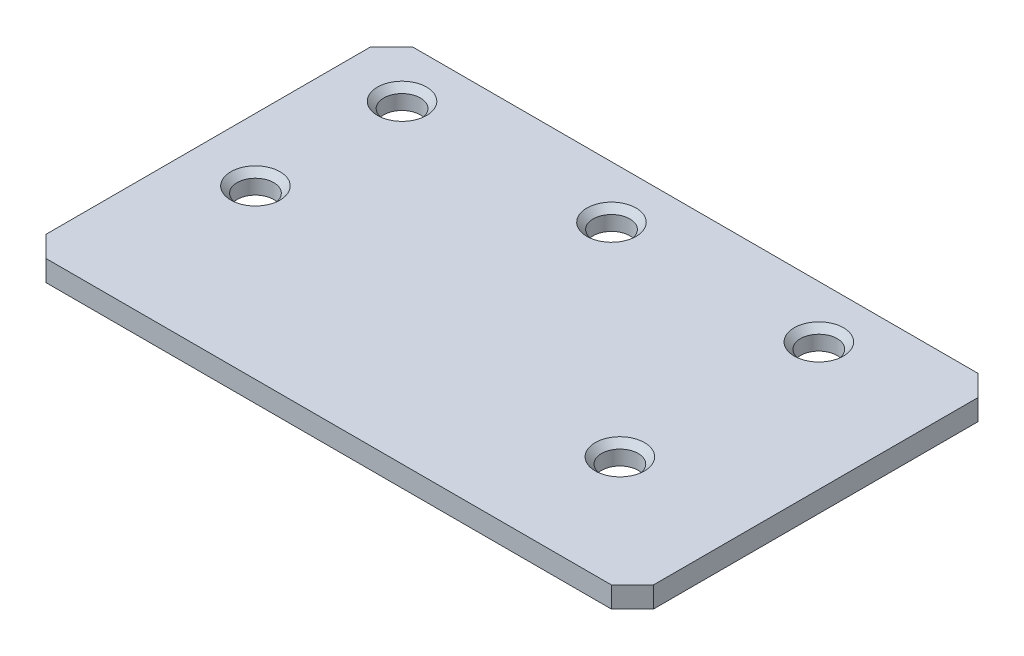
ISO-10303-21;
HEADER;
FILE_DESCRIPTION(('STEP AP214'),'2;1');
FILE_NAME('part.step','',(''),(''),'','','');
FILE_SCHEMA(('AUTOMOTIVE_DESIGN { 1 0 10303 214 1 1 1 1 }'));
ENDSEC;
DATA;
#1=APPLICATION_CONTEXT('core data for automotive mechanical design processes');
#2=APPLICATION_PROTOCOL_DEFINITION('international standard','automotive_design',2000,#1);
#3=PRODUCT_CONTEXT('',#1,'mechanical');
#4=PRODUCT('Part','Part','',(#3));
#5=PRODUCT_RELATED_PRODUCT_CATEGORY('part','',(#4));
#6=PRODUCT_DEFINITION_FORMATION('','',#4);
#7=PRODUCT_DEFINITION_CONTEXT('part definition',#1,'design');
#8=PRODUCT_DEFINITION('design','',#6,#7);
#9=PRODUCT_DEFINITION_SHAPE('','',#8);
#10=(LENGTH_UNIT() NAMED_UNIT(*) SI_UNIT(.MILLI.,.METRE.));
#11=(NAMED_UNIT(*) PLANE_ANGLE_UNIT() SI_UNIT($,.RADIAN.));
#12=(NAMED_UNIT(*) SI_UNIT($,.STERADIAN.) SOLID_ANGLE_UNIT());
#13=UNCERTAINTY_MEASURE_WITH_UNIT(LENGTH_MEASURE(1.E-05),#10,'distance_accuracy_value','');
#14=(GEOMETRIC_REPRESENTATION_CONTEXT(3) GLOBAL_UNCERTAINTY_ASSIGNED_CONTEXT((#13)) GLOBAL_UNIT_ASSIGNED_CONTEXT((#10,
#11,#12)) REPRESENTATION_CONTEXT('',''));
#15=CARTESIAN_POINT('',(0.,0.,0.));
#16=DIRECTION('',(0.,0.,1.));
#17=DIRECTION('',(1.,0.,0.));
#18=AXIS2_PLACEMENT_3D('',#15,#16,#17);
#19=CARTESIAN_POINT('',(29.,2.,17.5));
#20=DIRECTION('',(-1.,0.,0.));
#21=DIRECTION('',(0.,0.,1.));
#22=AXIS2_PLACEMENT_3D('',#19,#20,#21);
#23=PLANE('',#22);
#24=DIRECTION('',(0.,0.,-1.));
#25=VECTOR('',#24,1.);
#26=CARTESIAN_POINT('',(29.,2.,17.5));
#27=LINE('',#26,#25);
#28=CARTESIAN_POINT('',(29.,2.,15.5));
#29=VERTEX_POINT('',#28);
#30=CARTESIAN_POINT('',(29.,2.,-15.5));
#31=VERTEX_POINT('',#30);
#32=EDGE_CURVE('E149',#29,#31,#27,.T.);
#33=ORIENTED_EDGE('',*,*,#32,.F.);
#34=DIRECTION('',(0.,-1.,0.));
#35=VECTOR('',#34,1.);
#36=CARTESIAN_POINT('',(29.,2.,15.5));
#37=LINE('',#36,#35);
#38=CARTESIAN_POINT('',(29.,0.,15.5));
#39=VERTEX_POINT('',#38);
#40=EDGE_CURVE('E11',#29,#39,#37,.T.);
#41=ORIENTED_EDGE('',*,*,#40,.T.);
#42=DIRECTION('',(0.,0.,-1.));
#43=VECTOR('',#42,1.);
#44=CARTESIAN_POINT('',(29.,0.,17.5));
#45=LINE('',#44,#43);
#46=CARTESIAN_POINT('',(29.,0.,-15.5));
#47=VERTEX_POINT('',#46);
#48=EDGE_CURVE('E151',#39,#47,#45,.T.);
#49=ORIENTED_EDGE('',*,*,#48,.T.);
#50=DIRECTION('',(0.,1.,0.));
#51=VECTOR('',#50,1.);
#52=CARTESIAN_POINT('',(29.,2.,-15.5));
#53=LINE('',#52,#51);
#54=EDGE_CURVE('E57',#47,#31,#53,.T.);
#55=ORIENTED_EDGE('',*,*,#54,.T.);
#56=EDGE_LOOP('',(#33,#41,#49,#55));
#57=FACE_BOUND('',#56,.T.);
#58=ADVANCED_FACE('F47',(#57),#23,.F.);
#59=CARTESIAN_POINT('',(-29.,2.,-17.5));
#60=DIRECTION('',(0.,0.,1.));
#61=DIRECTION('',(1.,0.,0.));
#62=AXIS2_PLACEMENT_3D('',#59,#60,#61);
#63=PLANE('',#62);
#64=DIRECTION('',(-1.,0.,0.));
#65=VECTOR('',#64,1.);
#66=CARTESIAN_POINT('',(-29.,0.,-17.5));
#67=LINE('',#66,#65);
#68=CARTESIAN_POINT('',(27.,0.,-17.5));
#69=VERTEX_POINT('',#68);
#70=CARTESIAN_POINT('',(-27.,0.,-17.5));
#71=VERTEX_POINT('',#70);
#72=EDGE_CURVE('E145',#69,#71,#67,.T.);
#73=ORIENTED_EDGE('',*,*,#72,.T.);
#74=DIRECTION('',(0.,1.,0.));
#75=VECTOR('',#74,1.);
#76=CARTESIAN_POINT('',(-27.,2.,-17.5));
#77=LINE('',#76,#75);
#78=CARTESIAN_POINT('',(-27.,2.,-17.5));
#79=VERTEX_POINT('',#78);
#80=EDGE_CURVE('E121',#71,#79,#77,.T.);
#81=ORIENTED_EDGE('',*,*,#80,.T.);
#82=DIRECTION('',(-1.,0.,0.));
#83=VECTOR('',#82,1.);
#84=CARTESIAN_POINT('',(-29.,2.,-17.5));
#85=LINE('',#84,#83);
#86=CARTESIAN_POINT('',(27.,2.,-17.5));
#87=VERTEX_POINT('',#86);
#88=EDGE_CURVE('E201',#87,#79,#85,.T.);
#89=ORIENTED_EDGE('',*,*,#88,.F.);
#90=DIRECTION('',(0.,-1.,0.));
#91=VECTOR('',#90,1.);
#92=CARTESIAN_POINT('',(27.,2.,-17.5));
#93=LINE('',#92,#91);
#94=EDGE_CURVE('E127',#87,#69,#93,.T.);
#95=ORIENTED_EDGE('',*,*,#94,.T.);
#96=EDGE_LOOP('',(#73,#81,#89,#95));
#97=FACE_BOUND('',#96,.T.);
#98=ADVANCED_FACE('F205',(#97),#63,.F.);
#99=CARTESIAN_POINT('',(-29.,2.,17.5));
#100=DIRECTION('',(1.,0.,0.));
#101=DIRECTION('',(0.,0.,-1.));
#102=AXIS2_PLACEMENT_3D('',#99,#100,#101);
#103=PLANE('',#102);
#104=DIRECTION('',(0.,0.,1.));
#105=VECTOR('',#104,1.);
#106=CARTESIAN_POINT('',(-29.,2.,17.5));
#107=LINE('',#106,#105);
#108=CARTESIAN_POINT('',(-29.,2.,-15.5));
#109=VERTEX_POINT('',#108);
#110=CARTESIAN_POINT('',(-29.,2.,15.5));
#111=VERTEX_POINT('',#110);
#112=EDGE_CURVE('E136',#109,#111,#107,.T.);
#113=ORIENTED_EDGE('',*,*,#112,.F.);
#114=DIRECTION('',(0.,-1.,0.));
#115=VECTOR('',#114,1.);
#116=CARTESIAN_POINT('',(-29.,2.,-15.5));
#117=LINE('',#116,#115);
#118=CARTESIAN_POINT('',(-29.,0.,-15.5));
#119=VERTEX_POINT('',#118);
#120=EDGE_CURVE('E120',#109,#119,#117,.T.);
#121=ORIENTED_EDGE('',*,*,#120,.T.);
#122=DIRECTION('',(0.,0.,1.));
#123=VECTOR('',#122,1.);
#124=CARTESIAN_POINT('',(-29.,0.,17.5));
#125=LINE('',#124,#123);
#126=CARTESIAN_POINT('',(-29.,0.,15.5));
#127=VERTEX_POINT('',#126);
#128=EDGE_CURVE('E134',#119,#127,#125,.T.);
#129=ORIENTED_EDGE('',*,*,#128,.T.);
#130=DIRECTION('',(0.,1.,0.));
#131=VECTOR('',#130,1.);
#132=CARTESIAN_POINT('',(-29.,2.,15.5));
#133=LINE('',#132,#131);
#134=EDGE_CURVE('E139',#127,#111,#133,.T.);
#135=ORIENTED_EDGE('',*,*,#134,.T.);
#136=EDGE_LOOP('',(#113,#121,#129,#135));
#137=FACE_BOUND('',#136,.T.);
#138=ADVANCED_FACE('F133',(#137),#103,.F.);
#139=CARTESIAN_POINT('',(-29.,2.,17.5));
#140=DIRECTION('',(0.,0.,-1.));
#141=DIRECTION('',(-1.,0.,0.));
#142=AXIS2_PLACEMENT_3D('',#139,#140,#141);
#143=PLANE('',#142);
#144=DIRECTION('',(1.,0.,0.));
#145=VECTOR('',#144,1.);
#146=CARTESIAN_POINT('',(-29.,2.,17.5));
#147=LINE('',#146,#145);
#148=CARTESIAN_POINT('',(-27.,2.,17.5));
#149=VERTEX_POINT('',#148);
#150=CARTESIAN_POINT('',(27.,2.,17.5));
#151=VERTEX_POINT('',#150);
#152=EDGE_CURVE('E156',#149,#151,#147,.T.);
#153=ORIENTED_EDGE('',*,*,#152,.F.);
#154=DIRECTION('',(0.,-1.,0.));
#155=VECTOR('',#154,1.);
#156=CARTESIAN_POINT('',(-27.,2.,17.5));
#157=LINE('',#156,#155);
#158=CARTESIAN_POINT('',(-27.,0.,17.5));
#159=VERTEX_POINT('',#158);
#160=EDGE_CURVE('E183',#149,#159,#157,.T.);
#161=ORIENTED_EDGE('',*,*,#160,.T.);
#162=DIRECTION('',(1.,0.,0.));
#163=VECTOR('',#162,1.);
#164=CARTESIAN_POINT('',(-29.,0.,17.5));
#165=LINE('',#164,#163);
#166=CARTESIAN_POINT('',(27.,0.,17.5));
#167=VERTEX_POINT('',#166);
#168=EDGE_CURVE('E144',#159,#167,#165,.T.);
#169=ORIENTED_EDGE('',*,*,#168,.T.);
#170=DIRECTION('',(0.,1.,0.));
#171=VECTOR('',#170,1.);
#172=CARTESIAN_POINT('',(27.,2.,17.5));
#173=LINE('',#172,#171);
#174=EDGE_CURVE('E64',#167,#151,#173,.T.);
#175=ORIENTED_EDGE('',*,*,#174,.T.);
#176=EDGE_LOOP('',(#153,#161,#169,#175));
#177=FACE_BOUND('',#176,.T.);
#178=ADVANCED_FACE('F279',(#177),#143,.F.);
#179=CARTESIAN_POINT('',(0.,2.,0.));
#180=DIRECTION('',(0.,-1.,0.));
#181=DIRECTION('',(0.,0.,-1.));
#182=AXIS2_PLACEMENT_3D('',#179,#180,#181);
#183=PLANE('',#182);
#184=CARTESIAN_POINT('',(-23.,2.,-12.5));
#185=DIRECTION('',(0.,1.,0.));
#186=DIRECTION('',(0.,0.,1.));
#187=AXIS2_PLACEMENT_3D('',#184,#185,#186);
#188=CIRCLE('',#187,2.35);
#189=CARTESIAN_POINT('',(-23.,2.,-10.15));
#190=VERTEX_POINT('',#189);
#191=EDGE_CURVE('E270',#190,#190,#188,.T.);
#192=ORIENTED_EDGE('',*,*,#191,.F.);
#193=EDGE_LOOP('',(#192));
#194=FACE_BOUND('',#193,.T.);
#195=CARTESIAN_POINT('',(-3.,2.,-12.5));
#196=DIRECTION('',(0.,1.,0.));
#197=DIRECTION('',(0.,0.,1.));
#198=AXIS2_PLACEMENT_3D('',#195,#196,#197);
#199=CIRCLE('',#198,2.35);
#200=CARTESIAN_POINT('',(-3.,2.,-10.15));
#201=VERTEX_POINT('',#200);
#202=EDGE_CURVE('E258',#201,#201,#199,.T.);
#203=ORIENTED_EDGE('',*,*,#202,.F.);
#204=EDGE_LOOP('',(#203));
#205=FACE_BOUND('',#204,.T.);
#206=CARTESIAN_POINT('',(16.8,2.,-12.5));
#207=DIRECTION('',(0.,1.,0.));
#208=DIRECTION('',(0.,0.,1.));
#209=AXIS2_PLACEMENT_3D('',#206,#207,#208);
#210=CIRCLE('',#209,2.35);
#211=CARTESIAN_POINT('',(16.8,2.,-10.15));
#212=VERTEX_POINT('',#211);
#213=EDGE_CURVE('E246',#212,#212,#210,.T.);
#214=ORIENTED_EDGE('',*,*,#213,.F.);
#215=EDGE_LOOP('',(#214));
#216=FACE_BOUND('',#215,.T.);
#217=CARTESIAN_POINT('',(16.8,2.,6.5));
#218=DIRECTION('',(0.,1.,0.));
#219=DIRECTION('',(0.,0.,1.));
#220=AXIS2_PLACEMENT_3D('',#217,#218,#219);
#221=CIRCLE('',#220,2.35);
#222=CARTESIAN_POINT('',(16.8,2.,8.85));
#223=VERTEX_POINT('',#222);
#224=EDGE_CURVE('E234',#223,#223,#221,.T.);
#225=ORIENTED_EDGE('',*,*,#224,.F.);
#226=EDGE_LOOP('',(#225));
#227=FACE_BOUND('',#226,.T.);
#228=CARTESIAN_POINT('',(-23.,2.,1.5));
#229=DIRECTION('',(0.,1.,0.));
#230=DIRECTION('',(0.,0.,1.));
#231=AXIS2_PLACEMENT_3D('',#228,#229,#230);
#232=CIRCLE('',#231,2.35);
#233=CARTESIAN_POINT('',(-23.,2.,3.85));
#234=VERTEX_POINT('',#233);
#235=EDGE_CURVE('E222',#234,#234,#232,.T.);
#236=ORIENTED_EDGE('',*,*,#235,.F.);
#237=EDGE_LOOP('',(#236));
#238=FACE_BOUND('',#237,.T.);
#239=ORIENTED_EDGE('',*,*,#88,.T.);
#240=DIRECTION('',(0.707106781186549,0.,-0.707106781186546));
#241=VECTOR('',#240,1.);
#242=CARTESIAN_POINT('',(-29.,2.,-15.5));
#243=LINE('',#242,#241);
#244=EDGE_CURVE('E178',#79,#109,#243,.F.);
#245=ORIENTED_EDGE('',*,*,#244,.T.);
#246=ORIENTED_EDGE('',*,*,#112,.T.);
#247=DIRECTION('',(-0.707106781186548,0.,-0.707106781186548));
#248=VECTOR('',#247,1.);
#249=CARTESIAN_POINT('',(-27.,2.,17.5));
#250=LINE('',#249,#248);
#251=EDGE_CURVE('E71',#111,#149,#250,.F.);
#252=ORIENTED_EDGE('',*,*,#251,.T.);
#253=ORIENTED_EDGE('',*,*,#152,.T.);
#254=DIRECTION('',(-0.707106781186549,0.,0.707106781186546));
#255=VECTOR('',#254,1.);
#256=CARTESIAN_POINT('',(29.,2.,15.5));
#257=LINE('',#256,#255);
#258=EDGE_CURVE('E173',#151,#29,#257,.F.);
#259=ORIENTED_EDGE('',*,*,#258,.T.);
#260=ORIENTED_EDGE('',*,*,#32,.T.);
#261=DIRECTION('',(0.707106781186546,0.,0.707106781186549));
#262=VECTOR('',#261,1.);
#263=CARTESIAN_POINT('',(27.,2.,-17.5));
#264=LINE('',#263,#262);
#265=EDGE_CURVE('E170',#31,#87,#264,.F.);
#266=ORIENTED_EDGE('',*,*,#265,.T.);
#267=EDGE_LOOP('',(#239,#245,#246,#252,#253,#259,#260,#266));
#268=FACE_BOUND('',#267,.T.);
#269=ADVANCED_FACE('F197',(#194,#205,#216,#227,#238,#268),#183,.F.);
#270=CARTESIAN_POINT('',(0.,0.,0.));
#271=DIRECTION('',(0.,-1.,0.));
#272=DIRECTION('',(0.,0.,-1.));
#273=AXIS2_PLACEMENT_3D('',#270,#271,#272);
#274=PLANE('',#273);
#275=CARTESIAN_POINT('',(-23.,0.,-12.5));
#276=DIRECTION('',(0.,1.,0.));
#277=DIRECTION('',(0.,0.,1.));
#278=AXIS2_PLACEMENT_3D('',#275,#276,#277);
#279=CIRCLE('',#278,1.75);
#280=CARTESIAN_POINT('',(-23.,0.,-10.75));
#281=VERTEX_POINT('',#280);
#282=EDGE_CURVE('E262',#281,#281,#279,.T.);
#283=ORIENTED_EDGE('',*,*,#282,.T.);
#284=EDGE_LOOP('',(#283));
#285=FACE_BOUND('',#284,.T.);
#286=CARTESIAN_POINT('',(-3.,0.,-12.5));
#287=DIRECTION('',(0.,1.,0.));
#288=DIRECTION('',(0.,0.,1.));
#289=AXIS2_PLACEMENT_3D('',#286,#287,#288);
#290=CIRCLE('',#289,1.75);
#291=CARTESIAN_POINT('',(-3.,0.,-10.75));
#292=VERTEX_POINT('',#291);
#293=EDGE_CURVE('E250',#292,#292,#290,.T.);
#294=ORIENTED_EDGE('',*,*,#293,.T.);
#295=EDGE_LOOP('',(#294));
#296=FACE_BOUND('',#295,.T.);
#297=CARTESIAN_POINT('',(16.8,0.,-12.5));
#298=DIRECTION('',(0.,1.,0.));
#299=DIRECTION('',(0.,0.,1.));
#300=AXIS2_PLACEMENT_3D('',#297,#298,#299);
#301=CIRCLE('',#300,1.75);
#302=CARTESIAN_POINT('',(16.8,0.,-10.75));
#303=VERTEX_POINT('',#302);
#304=EDGE_CURVE('E238',#303,#303,#301,.T.);
#305=ORIENTED_EDGE('',*,*,#304,.T.);
#306=EDGE_LOOP('',(#305));
#307=FACE_BOUND('',#306,.T.);
#308=CARTESIAN_POINT('',(16.8,0.,6.5));
#309=DIRECTION('',(0.,1.,0.));
#310=DIRECTION('',(0.,0.,1.));
#311=AXIS2_PLACEMENT_3D('',#308,#309,#310);
#312=CIRCLE('',#311,1.75);
#313=CARTESIAN_POINT('',(16.8,0.,8.25));
#314=VERTEX_POINT('',#313);
#315=EDGE_CURVE('E226',#314,#314,#312,.T.);
#316=ORIENTED_EDGE('',*,*,#315,.T.);
#317=EDGE_LOOP('',(#316));
#318=FACE_BOUND('',#317,.T.);
#319=CARTESIAN_POINT('',(-23.,0.,1.5));
#320=DIRECTION('',(0.,1.,0.));
#321=DIRECTION('',(0.,0.,1.));
#322=AXIS2_PLACEMENT_3D('',#319,#320,#321);
#323=CIRCLE('',#322,1.75);
#324=CARTESIAN_POINT('',(-23.,0.,3.25));
#325=VERTEX_POINT('',#324);
#326=EDGE_CURVE('E207',#325,#325,#323,.T.);
#327=ORIENTED_EDGE('',*,*,#326,.T.);
#328=EDGE_LOOP('',(#327));
#329=FACE_BOUND('',#328,.T.);
#330=ORIENTED_EDGE('',*,*,#128,.F.);
#331=DIRECTION('',(-0.707106781186549,0.,0.707106781186546));
#332=VECTOR('',#331,1.);
#333=CARTESIAN_POINT('',(-22.2499999999999,0.,-22.25));
#334=LINE('',#333,#332);
#335=EDGE_CURVE('E116',#119,#71,#334,.F.);
#336=ORIENTED_EDGE('',*,*,#335,.T.);
#337=ORIENTED_EDGE('',*,*,#72,.F.);
#338=DIRECTION('',(-0.707106781186546,0.,-0.707106781186549));
#339=VECTOR('',#338,1.);
#340=CARTESIAN_POINT('',(22.25,0.,-22.25));
#341=LINE('',#340,#339);
#342=EDGE_CURVE('E138',#69,#47,#341,.F.);
#343=ORIENTED_EDGE('',*,*,#342,.T.);
#344=ORIENTED_EDGE('',*,*,#48,.F.);
#345=DIRECTION('',(0.707106781186549,0.,-0.707106781186546));
#346=VECTOR('',#345,1.);
#347=CARTESIAN_POINT('',(22.2499999999999,0.,22.25));
#348=LINE('',#347,#346);
#349=EDGE_CURVE('E160',#39,#167,#348,.F.);
#350=ORIENTED_EDGE('',*,*,#349,.T.);
#351=ORIENTED_EDGE('',*,*,#168,.F.);
#352=DIRECTION('',(0.707106781186548,0.,0.707106781186548));
#353=VECTOR('',#352,1.);
#354=CARTESIAN_POINT('',(-22.25,0.,22.25));
#355=LINE('',#354,#353);
#356=EDGE_CURVE('E128',#159,#127,#355,.F.);
#357=ORIENTED_EDGE('',*,*,#356,.T.);
#358=EDGE_LOOP('',(#330,#336,#337,#343,#344,#350,#351,#357));
#359=FACE_BOUND('',#358,.T.);
#360=ADVANCED_FACE('F141',(#285,#296,#307,#318,#329,#359),#274,.T.);
#361=CARTESIAN_POINT('',(-23.,2.,1.5));
#362=DIRECTION('',(0.,1.,0.));
#363=DIRECTION('',(0.,0.,1.));
#364=AXIS2_PLACEMENT_3D('',#361,#362,#363);
#365=CYLINDRICAL_SURFACE('',#364,1.75);
#366=ORIENTED_EDGE('',*,*,#326,.F.);
#367=EDGE_LOOP('',(#366));
#368=FACE_BOUND('',#367,.T.);
#369=CARTESIAN_POINT('',(-23.,1.4,1.5));
#370=DIRECTION('',(0.,1.,0.));
#371=DIRECTION('',(0.,0.,1.));
#372=AXIS2_PLACEMENT_3D('',#369,#370,#371);
#373=CIRCLE('',#372,1.75);
#374=CARTESIAN_POINT('',(-23.,1.4,3.25));
#375=VERTEX_POINT('',#374);
#376=EDGE_CURVE('E210',#375,#375,#373,.T.);
#377=ORIENTED_EDGE('',*,*,#376,.T.);
#378=EDGE_LOOP('',(#377));
#379=FACE_BOUND('',#378,.T.);
#380=ADVANCED_FACE('F292',(#368,#379),#365,.F.);
#381=CARTESIAN_POINT('',(-23.,2.,1.5));
#382=DIRECTION('',(0.,1.,0.));
#383=DIRECTION('',(0.,0.,1.));
#384=AXIS2_PLACEMENT_3D('',#381,#382,#383);
#385=CONICAL_SURFACE('',#384,2.35,0.785398163397452);
#386=ORIENTED_EDGE('',*,*,#376,.F.);
#387=EDGE_LOOP('',(#386));
#388=FACE_BOUND('',#387,.T.);
#389=ORIENTED_EDGE('',*,*,#235,.T.);
#390=EDGE_LOOP('',(#389));
#391=FACE_BOUND('',#390,.T.);
#392=ADVANCED_FACE('F289',(#388,#391),#385,.F.);
#393=CARTESIAN_POINT('',(16.8,2.,6.5));
#394=DIRECTION('',(0.,1.,0.));
#395=DIRECTION('',(0.,0.,1.));
#396=AXIS2_PLACEMENT_3D('',#393,#394,#395);
#397=CYLINDRICAL_SURFACE('',#396,1.75);
#398=ORIENTED_EDGE('',*,*,#315,.F.);
#399=EDGE_LOOP('',(#398));
#400=FACE_BOUND('',#399,.T.);
#401=CARTESIAN_POINT('',(16.8,1.4,6.5));
#402=DIRECTION('',(0.,1.,0.));
#403=DIRECTION('',(0.,0.,1.));
#404=AXIS2_PLACEMENT_3D('',#401,#402,#403);
#405=CIRCLE('',#404,1.75);
#406=CARTESIAN_POINT('',(16.8,1.4,8.25));
#407=VERTEX_POINT('',#406);
#408=EDGE_CURVE('E230',#407,#407,#405,.T.);
#409=ORIENTED_EDGE('',*,*,#408,.T.);
#410=EDGE_LOOP('',(#409));
#411=FACE_BOUND('',#410,.T.);
#412=ADVANCED_FACE('F291',(#400,#411),#397,.F.);
#413=CARTESIAN_POINT('',(16.8,2.,6.5));
#414=DIRECTION('',(0.,1.,0.));
#415=DIRECTION('',(0.,0.,1.));
#416=AXIS2_PLACEMENT_3D('',#413,#414,#415);
#417=CONICAL_SURFACE('',#416,2.35,0.785398163397449);
#418=ORIENTED_EDGE('',*,*,#408,.F.);
#419=EDGE_LOOP('',(#418));
#420=FACE_BOUND('',#419,.T.);
#421=ORIENTED_EDGE('',*,*,#224,.T.);
#422=EDGE_LOOP('',(#421));
#423=FACE_BOUND('',#422,.T.);
#424=ADVANCED_FACE('F299',(#420,#423),#417,.F.);
#425=CARTESIAN_POINT('',(16.8,2.,-12.5));
#426=DIRECTION('',(0.,1.,0.));
#427=DIRECTION('',(0.,0.,1.));
#428=AXIS2_PLACEMENT_3D('',#425,#426,#427);
#429=CYLINDRICAL_SURFACE('',#428,1.75);
#430=ORIENTED_EDGE('',*,*,#304,.F.);
#431=EDGE_LOOP('',(#430));
#432=FACE_BOUND('',#431,.T.);
#433=CARTESIAN_POINT('',(16.8,1.4,-12.5));
#434=DIRECTION('',(0.,1.,0.));
#435=DIRECTION('',(0.,0.,1.));
#436=AXIS2_PLACEMENT_3D('',#433,#434,#435);
#437=CIRCLE('',#436,1.75);
#438=CARTESIAN_POINT('',(16.8,1.4,-10.75));
#439=VERTEX_POINT('',#438);
#440=EDGE_CURVE('E242',#439,#439,#437,.T.);
#441=ORIENTED_EDGE('',*,*,#440,.T.);
#442=EDGE_LOOP('',(#441));
#443=FACE_BOUND('',#442,.T.);
#444=ADVANCED_FACE('F402',(#432,#443),#429,.F.);
#445=CARTESIAN_POINT('',(16.8,2.,-12.5));
#446=DIRECTION('',(0.,1.,0.));
#447=DIRECTION('',(0.,0.,1.));
#448=AXIS2_PLACEMENT_3D('',#445,#446,#447);
#449=CONICAL_SURFACE('',#448,2.35,0.785398163397452);
#450=ORIENTED_EDGE('',*,*,#440,.F.);
#451=EDGE_LOOP('',(#450));
#452=FACE_BOUND('',#451,.T.);
#453=ORIENTED_EDGE('',*,*,#213,.T.);
#454=EDGE_LOOP('',(#453));
#455=FACE_BOUND('',#454,.T.);
#456=ADVANCED_FACE('F392',(#452,#455),#449,.F.);
#457=CARTESIAN_POINT('',(-3.,2.,-12.5));
#458=DIRECTION('',(0.,1.,0.));
#459=DIRECTION('',(0.,0.,1.));
#460=AXIS2_PLACEMENT_3D('',#457,#458,#459);
#461=CYLINDRICAL_SURFACE('',#460,1.75);
#462=ORIENTED_EDGE('',*,*,#293,.F.);
#463=EDGE_LOOP('',(#462));
#464=FACE_BOUND('',#463,.T.);
#465=CARTESIAN_POINT('',(-3.,1.4,-12.5));
#466=DIRECTION('',(0.,1.,0.));
#467=DIRECTION('',(0.,0.,1.));
#468=AXIS2_PLACEMENT_3D('',#465,#466,#467);
#469=CIRCLE('',#468,1.75);
#470=CARTESIAN_POINT('',(-3.,1.4,-10.75));
#471=VERTEX_POINT('',#470);
#472=EDGE_CURVE('E254',#471,#471,#469,.T.);
#473=ORIENTED_EDGE('',*,*,#472,.T.);
#474=EDGE_LOOP('',(#473));
#475=FACE_BOUND('',#474,.T.);
#476=ADVANCED_FACE('F382',(#464,#475),#461,.F.);
#477=CARTESIAN_POINT('',(-3.,2.,-12.5));
#478=DIRECTION('',(0.,1.,0.));
#479=DIRECTION('',(0.,0.,1.));
#480=AXIS2_PLACEMENT_3D('',#477,#478,#479);
#481=CONICAL_SURFACE('',#480,2.35,0.785398163397449);
#482=ORIENTED_EDGE('',*,*,#472,.F.);
#483=EDGE_LOOP('',(#482));
#484=FACE_BOUND('',#483,.T.);
#485=ORIENTED_EDGE('',*,*,#202,.T.);
#486=EDGE_LOOP('',(#485));
#487=FACE_BOUND('',#486,.T.);
#488=ADVANCED_FACE('F372',(#484,#487),#481,.F.);
#489=CARTESIAN_POINT('',(-23.,2.,-12.5));
#490=DIRECTION('',(0.,1.,0.));
#491=DIRECTION('',(0.,0.,1.));
#492=AXIS2_PLACEMENT_3D('',#489,#490,#491);
#493=CYLINDRICAL_SURFACE('',#492,1.75);
#494=ORIENTED_EDGE('',*,*,#282,.F.);
#495=EDGE_LOOP('',(#494));
#496=FACE_BOUND('',#495,.T.);
#497=CARTESIAN_POINT('',(-23.,1.4,-12.5));
#498=DIRECTION('',(0.,1.,0.));
#499=DIRECTION('',(0.,0.,1.));
#500=AXIS2_PLACEMENT_3D('',#497,#498,#499);
#501=CIRCLE('',#500,1.75);
#502=CARTESIAN_POINT('',(-23.,1.4,-10.75));
#503=VERTEX_POINT('',#502);
#504=EDGE_CURVE('E266',#503,#503,#501,.T.);
#505=ORIENTED_EDGE('',*,*,#504,.T.);
#506=EDGE_LOOP('',(#505));
#507=FACE_BOUND('',#506,.T.);
#508=ADVANCED_FACE('F362',(#496,#507),#493,.F.);
#509=CARTESIAN_POINT('',(-23.,2.,-12.5));
#510=DIRECTION('',(0.,1.,0.));
#511=DIRECTION('',(0.,0.,1.));
#512=AXIS2_PLACEMENT_3D('',#509,#510,#511);
#513=CONICAL_SURFACE('',#512,2.35,0.785398163397452);
#514=ORIENTED_EDGE('',*,*,#504,.F.);
#515=EDGE_LOOP('',(#514));
#516=FACE_BOUND('',#515,.T.);
#517=ORIENTED_EDGE('',*,*,#191,.T.);
#518=EDGE_LOOP('',(#517));
#519=FACE_BOUND('',#518,.T.);
#520=ADVANCED_FACE('F275',(#516,#519),#513,.F.);
#521=CARTESIAN_POINT('',(-29.,2.,-15.5));
#522=DIRECTION('',(0.707106781186546,0.,0.707106781186549));
#523=DIRECTION('',(0.,-1.,0.));
#524=AXIS2_PLACEMENT_3D('',#521,#522,#523);
#525=PLANE('',#524);
#526=ORIENTED_EDGE('',*,*,#244,.F.);
#527=ORIENTED_EDGE('',*,*,#80,.F.);
#528=ORIENTED_EDGE('',*,*,#335,.F.);
#529=ORIENTED_EDGE('',*,*,#120,.F.);
#530=EDGE_LOOP('',(#526,#527,#528,#529));
#531=FACE_BOUND('',#530,.T.);
#532=ADVANCED_FACE('F119',(#531),#525,.F.);
#533=CARTESIAN_POINT('',(-27.,2.,17.5));
#534=DIRECTION('',(0.707106781186547,0.,-0.707106781186547));
#535=DIRECTION('',(0.,-1.,0.));
#536=AXIS2_PLACEMENT_3D('',#533,#534,#535);
#537=PLANE('',#536);
#538=ORIENTED_EDGE('',*,*,#251,.F.);
#539=ORIENTED_EDGE('',*,*,#134,.F.);
#540=ORIENTED_EDGE('',*,*,#356,.F.);
#541=ORIENTED_EDGE('',*,*,#160,.F.);
#542=EDGE_LOOP('',(#538,#539,#540,#541));
#543=FACE_BOUND('',#542,.T.);
#544=ADVANCED_FACE('F320',(#543),#537,.F.);
#545=CARTESIAN_POINT('',(29.,2.,15.5));
#546=DIRECTION('',(-0.707106781186546,0.,-0.707106781186549));
#547=DIRECTION('',(0.,-1.,0.));
#548=AXIS2_PLACEMENT_3D('',#545,#546,#547);
#549=PLANE('',#548);
#550=ORIENTED_EDGE('',*,*,#258,.F.);
#551=ORIENTED_EDGE('',*,*,#174,.F.);
#552=ORIENTED_EDGE('',*,*,#349,.F.);
#553=ORIENTED_EDGE('',*,*,#40,.F.);
#554=EDGE_LOOP('',(#550,#551,#552,#553));
#555=FACE_BOUND('',#554,.T.);
#556=ADVANCED_FACE('F325',(#555),#549,.F.);
#557=CARTESIAN_POINT('',(27.,2.,-17.5));
#558=DIRECTION('',(-0.707106781186549,0.,0.707106781186546));
#559=DIRECTION('',(0.,-1.,0.));
#560=AXIS2_PLACEMENT_3D('',#557,#558,#559);
#561=PLANE('',#560);
#562=ORIENTED_EDGE('',*,*,#265,.F.);
#563=ORIENTED_EDGE('',*,*,#54,.F.);
#564=ORIENTED_EDGE('',*,*,#342,.F.);
#565=ORIENTED_EDGE('',*,*,#94,.F.);
#566=EDGE_LOOP('',(#562,#563,#564,#565));
#567=FACE_BOUND('',#566,.T.);
#568=ADVANCED_FACE('F50',(#567),#561,.F.);
#569=CLOSED_SHELL('',(#58,#98,#138,#178,#269,#360,#380,#392,#412,#424,#444,#456,#476,#488,#508,
#520,#532,#544,#556,#568));
#570=MANIFOLD_SOLID_BREP('B2',#569);
#571=ADVANCED_BREP_SHAPE_REPRESENTATION('',(#18,#570),#14);
#572=SHAPE_DEFINITION_REPRESENTATION(#9,#571);
ENDSEC;
END-ISO-10303-21;
